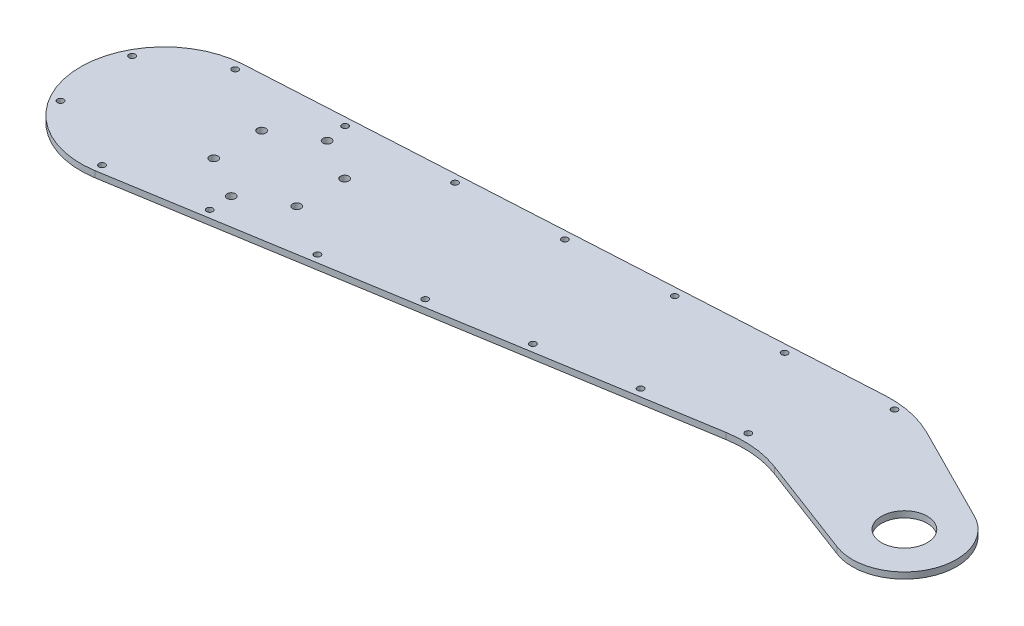
ISO-10303-21;
HEADER;
FILE_DESCRIPTION(('STEP AP214'),'2;1');
FILE_NAME('part.step','',(''),(''),'','','');
FILE_SCHEMA(('AUTOMOTIVE_DESIGN { 1 0 10303 214 1 1 1 1 }'));
ENDSEC;
DATA;
#1=APPLICATION_CONTEXT('core data for automotive mechanical design processes');
#2=APPLICATION_PROTOCOL_DEFINITION('international standard','automotive_design',2000,#1);
#3=PRODUCT_CONTEXT('',#1,'mechanical');
#4=PRODUCT('Part','Part','',(#3));
#5=PRODUCT_RELATED_PRODUCT_CATEGORY('part','',(#4));
#6=PRODUCT_DEFINITION_FORMATION('','',#4);
#7=PRODUCT_DEFINITION_CONTEXT('part definition',#1,'design');
#8=PRODUCT_DEFINITION('design','',#6,#7);
#9=PRODUCT_DEFINITION_SHAPE('','',#8);
#10=(LENGTH_UNIT() NAMED_UNIT(*) SI_UNIT(.MILLI.,.METRE.));
#11=(NAMED_UNIT(*) PLANE_ANGLE_UNIT() SI_UNIT($,.RADIAN.));
#12=(NAMED_UNIT(*) SI_UNIT($,.STERADIAN.) SOLID_ANGLE_UNIT());
#13=UNCERTAINTY_MEASURE_WITH_UNIT(LENGTH_MEASURE(1.E-05),#10,'distance_accuracy_value','');
#14=(GEOMETRIC_REPRESENTATION_CONTEXT(3) GLOBAL_UNCERTAINTY_ASSIGNED_CONTEXT((#13)) GLOBAL_UNIT_ASSIGNED_CONTEXT((#10,
#11,#12)) REPRESENTATION_CONTEXT('',''));
#15=CARTESIAN_POINT('',(0.,0.,0.));
#16=DIRECTION('',(0.,0.,1.));
#17=DIRECTION('',(1.,0.,0.));
#18=AXIS2_PLACEMENT_3D('',#15,#16,#17);
#19=CARTESIAN_POINT('',(6.06249999999998,3.,37.006703362364));
#20=DIRECTION('',(-0.161666666666666,0.,-0.986845422996372));
#21=DIRECTION('',(-0.986845422996372,0.,0.161666666666666));
#22=AXIS2_PLACEMENT_3D('',#19,#20,#21);
#23=PLANE('',#22);
#24=DIRECTION('',(0.986845422996372,0.,-0.161666666666666));
#25=VECTOR('',#24,1.);
#26=CARTESIAN_POINT('',(6.06249999999998,0.,37.006703362364));
#27=LINE('',#26,#25);
#28=CARTESIAN_POINT('',(-43.2100335309859,0.,45.0786121624165));
#29=VERTEX_POINT('',#28);
#30=CARTESIAN_POINT('',(216.856243279225,0.,2.47412000531818));
#31=VERTEX_POINT('',#30);
#32=EDGE_CURVE('E160',#29,#31,#27,.T.);
#33=ORIENTED_EDGE('',*,*,#32,.T.);
#34=DIRECTION('',(0.,-1.,0.));
#35=VECTOR('',#34,1.);
#36=CARTESIAN_POINT('',(216.856243279225,3.,2.47412000531818));
#37=LINE('',#36,#35);
#38=CARTESIAN_POINT('',(216.856243279225,3.,2.47412000531818));
#39=VERTEX_POINT('',#38);
#40=EDGE_CURVE('E180',#31,#39,#37,.F.);
#41=ORIENTED_EDGE('',*,*,#40,.T.);
#42=DIRECTION('',(0.986845422996372,0.,-0.161666666666666));
#43=VECTOR('',#42,1.);
#44=CARTESIAN_POINT('',(6.06249999999998,3.,37.006703362364));
#45=LINE('',#44,#43);
#46=CARTESIAN_POINT('',(-43.2100335309859,3.,45.0786121624165));
#47=VERTEX_POINT('',#46);
#48=EDGE_CURVE('E127',#47,#39,#45,.T.);
#49=ORIENTED_EDGE('',*,*,#48,.F.);
#50=DIRECTION('',(0.,-1.,0.));
#51=VECTOR('',#50,1.);
#52=CARTESIAN_POINT('',(-43.2100335309859,3.,45.0786121624165));
#53=LINE('',#52,#51);
#54=EDGE_CURVE('E138',#47,#29,#53,.T.);
#55=ORIENTED_EDGE('',*,*,#54,.T.);
#56=EDGE_LOOP('',(#33,#41,#49,#55));
#57=FACE_BOUND('',#56,.T.);
#58=ADVANCED_FACE('F35',(#57),#23,.F.);
#59=CARTESIAN_POINT('',(28.6353243988963,3.,-75.7957847250828));
#60=DIRECTION('',(-0.353415271219703,0.,0.935466539256591));
#61=DIRECTION('',(0.935466539256592,0.,0.353415271219703));
#62=AXIS2_PLACEMENT_3D('',#59,#60,#61);
#63=PLANE('',#62);
#64=DIRECTION('',(-0.935466539256591,0.,-0.353415271219703));
#65=VECTOR('',#64,1.);
#66=CARTESIAN_POINT('',(28.6353243988963,3.,-75.7957847250828));
#67=LINE('',#66,#65);
#68=CARTESIAN_POINT('',(291.164618219507,3.,23.3866634814148));
#69=VERTEX_POINT('',#68);
#70=CARTESIAN_POINT('',(242.610340173544,3.,5.04306419230725));
#71=VERTEX_POINT('',#70);
#72=EDGE_CURVE('E108',#69,#71,#67,.T.);
#73=ORIENTED_EDGE('',*,*,#72,.T.);
#74=DIRECTION('',(0.,-1.,0.));
#75=VECTOR('',#74,1.);
#76=CARTESIAN_POINT('',(242.610340173544,3.,5.04306419230723));
#77=LINE('',#76,#75);
#78=CARTESIAN_POINT('',(242.610340173544,0.,5.04306419230725));
#79=VERTEX_POINT('',#78);
#80=EDGE_CURVE('E114',#71,#79,#77,.T.);
#81=ORIENTED_EDGE('',*,*,#80,.T.);
#82=DIRECTION('',(-0.935466539256591,0.,-0.353415271219703));
#83=VECTOR('',#82,1.);
#84=CARTESIAN_POINT('',(28.6353243988963,0.,-75.7957847250828));
#85=LINE('',#84,#83);
#86=CARTESIAN_POINT('',(291.164618219507,0.,23.3866634814148));
#87=VERTEX_POINT('',#86);
#88=EDGE_CURVE('E111',#87,#79,#85,.T.);
#89=ORIENTED_EDGE('',*,*,#88,.F.);
#90=DIRECTION('',(0.,-1.,0.));
#91=VECTOR('',#90,1.);
#92=CARTESIAN_POINT('',(291.164618219507,3.,23.3866634814148));
#93=LINE('',#92,#91);
#94=EDGE_CURVE('E103',#69,#87,#93,.T.);
#95=ORIENTED_EDGE('',*,*,#94,.F.);
#96=EDGE_LOOP('',(#73,#81,#89,#95));
#97=FACE_BOUND('',#96,.T.);
#98=ADVANCED_FACE('F105',(#97),#63,.T.);
#99=CARTESIAN_POINT('',(300.,3.,0.));
#100=DIRECTION('',(0.,-1.,0.));
#101=DIRECTION('',(0.,0.,-1.));
#102=AXIS2_PLACEMENT_3D('',#99,#100,#101);
#103=CYLINDRICAL_SURFACE('',#102,25.);
#104=CARTESIAN_POINT('',(300.,0.,0.));
#105=DIRECTION('',(0.,1.,0.));
#106=DIRECTION('',(0.,0.,1.));
#107=AXIS2_PLACEMENT_3D('',#104,#105,#106);
#108=CIRCLE('',#107,25.);
#109=CARTESIAN_POINT('',(311.267854407603,0.,-22.3167080244614));
#110=VERTEX_POINT('',#109);
#111=EDGE_CURVE('E164',#87,#110,#108,.T.);
#112=ORIENTED_EDGE('',*,*,#111,.T.);
#113=DIRECTION('',(0.,-1.,0.));
#114=VECTOR('',#113,1.);
#115=CARTESIAN_POINT('',(311.267854407603,3.,-22.3167080244614));
#116=LINE('',#115,#114);
#117=CARTESIAN_POINT('',(311.267854407603,3.,-22.3167080244614));
#118=VERTEX_POINT('',#117);
#119=EDGE_CURVE('E115',#118,#110,#116,.T.);
#120=ORIENTED_EDGE('',*,*,#119,.F.);
#121=CARTESIAN_POINT('',(300.,3.,0.));
#122=DIRECTION('',(0.,1.,0.));
#123=DIRECTION('',(0.,0.,1.));
#124=AXIS2_PLACEMENT_3D('',#121,#122,#123);
#125=CIRCLE('',#124,25.);
#126=EDGE_CURVE('E118',#69,#118,#125,.T.);
#127=ORIENTED_EDGE('',*,*,#126,.F.);
#128=ORIENTED_EDGE('',*,*,#94,.T.);
#129=EDGE_LOOP('',(#112,#120,#127,#128));
#130=FACE_BOUND('',#129,.T.);
#131=ADVANCED_FACE('F119',(#130),#103,.T.);
#132=CARTESIAN_POINT('',(72.2108350240547,3.,-143.018188125238));
#133=DIRECTION('',(-0.450714176304124,0.,0.892668320978455));
#134=DIRECTION('',(0.892668320978456,0.,0.450714176304124));
#135=AXIS2_PLACEMENT_3D('',#132,#133,#134);
#136=PLANE('',#135);
#137=DIRECTION('',(-0.892668320978455,0.,-0.450714176304124));
#138=VECTOR('',#137,1.);
#139=CARTESIAN_POINT('',(72.2108350240547,0.,-143.018188125238));
#140=LINE('',#139,#138);
#141=CARTESIAN_POINT('',(264.934966975781,0.,-45.7104912515122));
#142=VERTEX_POINT('',#141);
#143=EDGE_CURVE('E166',#110,#142,#140,.T.);
#144=ORIENTED_EDGE('',*,*,#143,.T.);
#145=DIRECTION('',(0.,-1.,0.));
#146=VECTOR('',#145,1.);
#147=CARTESIAN_POINT('',(264.934966975781,3.,-45.7104912515122));
#148=LINE('',#147,#146);
#149=CARTESIAN_POINT('',(264.934966975781,3.,-45.7104912515122));
#150=VERTEX_POINT('',#149);
#151=EDGE_CURVE('E52',#142,#150,#148,.F.);
#152=ORIENTED_EDGE('',*,*,#151,.T.);
#153=DIRECTION('',(-0.892668320978455,0.,-0.450714176304124));
#154=VECTOR('',#153,1.);
#155=CARTESIAN_POINT('',(72.2108350240547,3.,-143.018188125238));
#156=LINE('',#155,#154);
#157=EDGE_CURVE('E122',#118,#150,#156,.T.);
#158=ORIENTED_EDGE('',*,*,#157,.F.);
#159=ORIENTED_EDGE('',*,*,#119,.T.);
#160=EDGE_LOOP('',(#144,#152,#158,#159));
#161=FACE_BOUND('',#160,.T.);
#162=ADVANCED_FACE('F304',(#161),#136,.F.);
#163=CARTESIAN_POINT('',(-2.10015877365271,3.,-37.4411449227377));
#164=DIRECTION('',(0.0560042339640722,0.,0.998430531273006));
#165=DIRECTION('',(0.998430531273006,0.,-0.0560042339640722));
#166=AXIS2_PLACEMENT_3D('',#163,#164,#165);
#167=PLANE('',#166);
#168=DIRECTION('',(-0.998430531273006,0.,0.0560042339640722));
#169=VECTOR('',#168,1.);
#170=CARTESIAN_POINT('',(-2.10015877365271,3.,-37.4411449227377));
#171=LINE('',#170,#169);
#172=CARTESIAN_POINT('',(239.599046462371,3.,-50.9986017662398));
#173=VERTEX_POINT('',#172);
#174=CARTESIAN_POINT('',(-51.9511290311193,3.,-34.6448908878421));
#175=VERTEX_POINT('',#174);
#176=EDGE_CURVE('E134',#173,#175,#171,.T.);
#177=ORIENTED_EDGE('',*,*,#176,.F.);
#178=DIRECTION('',(0.,-1.,0.));
#179=VECTOR('',#178,1.);
#180=CARTESIAN_POINT('',(239.599046462371,3.,-50.9986017662398));
#181=LINE('',#180,#179);
#182=CARTESIAN_POINT('',(239.599046462371,0.,-50.9986017662398));
#183=VERTEX_POINT('',#182);
#184=EDGE_CURVE('E182',#173,#183,#181,.T.);
#185=ORIENTED_EDGE('',*,*,#184,.T.);
#186=DIRECTION('',(-0.998430531273006,0.,0.0560042339640722));
#187=VECTOR('',#186,1.);
#188=CARTESIAN_POINT('',(-2.10015877365271,0.,-37.4411449227377));
#189=LINE('',#188,#187);
#190=CARTESIAN_POINT('',(-51.9511290311193,0.,-34.6448908878421));
#191=VERTEX_POINT('',#190);
#192=EDGE_CURVE('E168',#183,#191,#189,.T.);
#193=ORIENTED_EDGE('',*,*,#192,.T.);
#194=DIRECTION('',(0.,-1.,0.));
#195=VECTOR('',#194,1.);
#196=CARTESIAN_POINT('',(-51.9511290311193,3.,-34.6448908878421));
#197=LINE('',#196,#195);
#198=EDGE_CURVE('E175',#175,#191,#197,.T.);
#199=ORIENTED_EDGE('',*,*,#198,.F.);
#200=EDGE_LOOP('',(#177,#185,#193,#199));
#201=FACE_BOUND('',#200,.T.);
#202=ADVANCED_FACE('F267',(#201),#167,.F.);
#203=CARTESIAN_POINT('',(0.,3.,-23.));
#204=DIRECTION('',(0.,-1.,0.));
#205=DIRECTION('',(0.,0.,-1.));
#206=AXIS2_PLACEMENT_3D('',#203,#204,#205);
#207=CYLINDRICAL_SURFACE('',#206,2.);
#208=CARTESIAN_POINT('',(0.,3.,-23.));
#209=DIRECTION('',(0.,1.,0.));
#210=DIRECTION('',(0.,0.,1.));
#211=AXIS2_PLACEMENT_3D('',#208,#209,#210);
#212=CIRCLE('',#211,2.);
#213=CARTESIAN_POINT('',(0.,3.,-21.));
#214=VERTEX_POINT('',#213);
#215=EDGE_CURVE('E129',#214,#214,#212,.T.);
#216=ORIENTED_EDGE('',*,*,#215,.T.);
#217=EDGE_LOOP('',(#216));
#218=FACE_BOUND('',#217,.T.);
#219=CARTESIAN_POINT('',(0.,0.,-23.));
#220=DIRECTION('',(0.,1.,0.));
#221=DIRECTION('',(0.,0.,1.));
#222=AXIS2_PLACEMENT_3D('',#219,#220,#221);
#223=CIRCLE('',#222,2.);
#224=CARTESIAN_POINT('',(0.,0.,-21.));
#225=VERTEX_POINT('',#224);
#226=EDGE_CURVE('E157',#225,#225,#223,.T.);
#227=ORIENTED_EDGE('',*,*,#226,.F.);
#228=EDGE_LOOP('',(#227));
#229=FACE_BOUND('',#228,.T.);
#230=ADVANCED_FACE('F263',(#218,#229),#207,.F.);
#231=CARTESIAN_POINT('',(19.9185842870421,3.,-11.5));
#232=DIRECTION('',(0.,-1.,0.));
#233=DIRECTION('',(0.,0.,-1.));
#234=AXIS2_PLACEMENT_3D('',#231,#232,#233);
#235=CYLINDRICAL_SURFACE('',#234,2.);
#236=CARTESIAN_POINT('',(19.9185842870421,3.,-11.5));
#237=DIRECTION('',(0.,1.,0.));
#238=DIRECTION('',(0.,0.,1.));
#239=AXIS2_PLACEMENT_3D('',#236,#237,#238);
#240=CIRCLE('',#239,2.);
#241=CARTESIAN_POINT('',(19.9185842870421,3.,-9.49999999999995));
#242=VERTEX_POINT('',#241);
#243=EDGE_CURVE('E736',#242,#242,#240,.T.);
#244=ORIENTED_EDGE('',*,*,#243,.T.);
#245=EDGE_LOOP('',(#244));
#246=FACE_BOUND('',#245,.T.);
#247=CARTESIAN_POINT('',(19.9185842870421,0.,-11.5));
#248=DIRECTION('',(0.,1.,0.));
#249=DIRECTION('',(0.,0.,1.));
#250=AXIS2_PLACEMENT_3D('',#247,#248,#249);
#251=CIRCLE('',#250,2.);
#252=CARTESIAN_POINT('',(19.9185842870421,0.,-9.49999999999995));
#253=VERTEX_POINT('',#252);
#254=EDGE_CURVE('E154',#253,#253,#251,.T.);
#255=ORIENTED_EDGE('',*,*,#254,.F.);
#256=EDGE_LOOP('',(#255));
#257=FACE_BOUND('',#256,.T.);
#258=ADVANCED_FACE('F266',(#246,#257),#235,.F.);
#259=CARTESIAN_POINT('',(19.918584287042,3.,11.5000000000001));
#260=DIRECTION('',(0.,-1.,0.));
#261=DIRECTION('',(0.,0.,-1.));
#262=AXIS2_PLACEMENT_3D('',#259,#260,#261);
#263=CYLINDRICAL_SURFACE('',#262,2.);
#264=CARTESIAN_POINT('',(19.918584287042,3.,11.5000000000001));
#265=DIRECTION('',(0.,1.,0.));
#266=DIRECTION('',(0.,0.,1.));
#267=AXIS2_PLACEMENT_3D('',#264,#265,#266);
#268=CIRCLE('',#267,2.);
#269=CARTESIAN_POINT('',(19.918584287042,3.,13.5000000000001));
#270=VERTEX_POINT('',#269);
#271=EDGE_CURVE('E733',#270,#270,#268,.T.);
#272=ORIENTED_EDGE('',*,*,#271,.T.);
#273=EDGE_LOOP('',(#272));
#274=FACE_BOUND('',#273,.T.);
#275=CARTESIAN_POINT('',(19.918584287042,0.,11.5000000000001));
#276=DIRECTION('',(0.,1.,0.));
#277=DIRECTION('',(0.,0.,1.));
#278=AXIS2_PLACEMENT_3D('',#275,#276,#277);
#279=CIRCLE('',#278,2.);
#280=CARTESIAN_POINT('',(19.918584287042,0.,13.5000000000001));
#281=VERTEX_POINT('',#280);
#282=EDGE_CURVE('E151',#281,#281,#279,.T.);
#283=ORIENTED_EDGE('',*,*,#282,.F.);
#284=EDGE_LOOP('',(#283));
#285=FACE_BOUND('',#284,.T.);
#286=ADVANCED_FACE('F271',(#274,#285),#263,.F.);
#287=CARTESIAN_POINT('',(-1.60608141586784E-13,3.,23.));
#288=DIRECTION('',(0.,-1.,0.));
#289=DIRECTION('',(0.,0.,-1.));
#290=AXIS2_PLACEMENT_3D('',#287,#288,#289);
#291=CYLINDRICAL_SURFACE('',#290,2.);
#292=CARTESIAN_POINT('',(-1.60608141586784E-13,3.,23.));
#293=DIRECTION('',(0.,1.,0.));
#294=DIRECTION('',(0.,0.,1.));
#295=AXIS2_PLACEMENT_3D('',#292,#293,#294);
#296=CIRCLE('',#295,2.);
#297=CARTESIAN_POINT('',(-1.60608141586784E-13,3.,25.));
#298=VERTEX_POINT('',#297);
#299=EDGE_CURVE('E730',#298,#298,#296,.T.);
#300=ORIENTED_EDGE('',*,*,#299,.T.);
#301=EDGE_LOOP('',(#300));
#302=FACE_BOUND('',#301,.T.);
#303=CARTESIAN_POINT('',(-1.60608141586784E-13,0.,23.));
#304=DIRECTION('',(0.,1.,0.));
#305=DIRECTION('',(0.,0.,1.));
#306=AXIS2_PLACEMENT_3D('',#303,#304,#305);
#307=CIRCLE('',#306,2.);
#308=CARTESIAN_POINT('',(-1.60608141586784E-13,0.,25.));
#309=VERTEX_POINT('',#308);
#310=EDGE_CURVE('E148',#309,#309,#307,.T.);
#311=ORIENTED_EDGE('',*,*,#310,.F.);
#312=EDGE_LOOP('',(#311));
#313=FACE_BOUND('',#312,.T.);
#314=ADVANCED_FACE('F275',(#302,#313),#291,.F.);
#315=CARTESIAN_POINT('',(-19.9185842870422,3.,11.4999999999998));
#316=DIRECTION('',(0.,-1.,0.));
#317=DIRECTION('',(0.,0.,-1.));
#318=AXIS2_PLACEMENT_3D('',#315,#316,#317);
#319=CYLINDRICAL_SURFACE('',#318,2.);
#320=CARTESIAN_POINT('',(-19.9185842870422,3.,11.4999999999998));
#321=DIRECTION('',(0.,1.,0.));
#322=DIRECTION('',(0.,0.,1.));
#323=AXIS2_PLACEMENT_3D('',#320,#321,#322);
#324=CIRCLE('',#323,2.);
#325=CARTESIAN_POINT('',(-19.9185842870422,3.,13.4999999999998));
#326=VERTEX_POINT('',#325);
#327=EDGE_CURVE('E727',#326,#326,#324,.T.);
#328=ORIENTED_EDGE('',*,*,#327,.T.);
#329=EDGE_LOOP('',(#328));
#330=FACE_BOUND('',#329,.T.);
#331=CARTESIAN_POINT('',(-19.9185842870422,0.,11.4999999999998));
#332=DIRECTION('',(0.,1.,0.));
#333=DIRECTION('',(0.,0.,1.));
#334=AXIS2_PLACEMENT_3D('',#331,#332,#333);
#335=CIRCLE('',#334,2.);
#336=CARTESIAN_POINT('',(-19.9185842870422,0.,13.4999999999998));
#337=VERTEX_POINT('',#336);
#338=EDGE_CURVE('E145',#337,#337,#335,.T.);
#339=ORIENTED_EDGE('',*,*,#338,.F.);
#340=EDGE_LOOP('',(#339));
#341=FACE_BOUND('',#340,.T.);
#342=ADVANCED_FACE('F279',(#330,#341),#319,.F.);
#343=CARTESIAN_POINT('',(-19.918584287042,3.,-11.5000000000002));
#344=DIRECTION('',(0.,-1.,0.));
#345=DIRECTION('',(0.,0.,-1.));
#346=AXIS2_PLACEMENT_3D('',#343,#344,#345);
#347=CYLINDRICAL_SURFACE('',#346,2.);
#348=CARTESIAN_POINT('',(-19.918584287042,3.,-11.5000000000002));
#349=DIRECTION('',(0.,1.,0.));
#350=DIRECTION('',(0.,0.,1.));
#351=AXIS2_PLACEMENT_3D('',#348,#349,#350);
#352=CIRCLE('',#351,2.);
#353=CARTESIAN_POINT('',(-19.918584287042,3.,-9.50000000000023));
#354=VERTEX_POINT('',#353);
#355=EDGE_CURVE('E724',#354,#354,#352,.T.);
#356=ORIENTED_EDGE('',*,*,#355,.T.);
#357=EDGE_LOOP('',(#356));
#358=FACE_BOUND('',#357,.T.);
#359=CARTESIAN_POINT('',(-19.918584287042,0.,-11.5000000000002));
#360=DIRECTION('',(0.,1.,0.));
#361=DIRECTION('',(0.,0.,1.));
#362=AXIS2_PLACEMENT_3D('',#359,#360,#361);
#363=CIRCLE('',#362,2.);
#364=CARTESIAN_POINT('',(-19.918584287042,0.,-9.50000000000023));
#365=VERTEX_POINT('',#364);
#366=EDGE_CURVE('E142',#365,#365,#363,.T.);
#367=ORIENTED_EDGE('',*,*,#366,.F.);
#368=EDGE_LOOP('',(#367));
#369=FACE_BOUND('',#368,.T.);
#370=ADVANCED_FACE('F283',(#358,#369),#347,.F.);
#371=CARTESIAN_POINT('',(300.,3.,0.));
#372=DIRECTION('',(0.,-1.,0.));
#373=DIRECTION('',(0.,0.,-1.));
#374=AXIS2_PLACEMENT_3D('',#371,#372,#373);
#375=CYLINDRICAL_SURFACE('',#374,11.);
#376=CARTESIAN_POINT('',(300.,3.,0.));
#377=DIRECTION('',(0.,1.,0.));
#378=DIRECTION('',(0.,0.,1.));
#379=AXIS2_PLACEMENT_3D('',#376,#377,#378);
#380=CIRCLE('',#379,11.);
#381=CARTESIAN_POINT('',(300.,3.,11.));
#382=VERTEX_POINT('',#381);
#383=EDGE_CURVE('E172',#382,#382,#380,.T.);
#384=ORIENTED_EDGE('',*,*,#383,.T.);
#385=EDGE_LOOP('',(#384));
#386=FACE_BOUND('',#385,.T.);
#387=CARTESIAN_POINT('',(300.,0.,0.));
#388=DIRECTION('',(0.,1.,0.));
#389=DIRECTION('',(0.,0.,1.));
#390=AXIS2_PLACEMENT_3D('',#387,#388,#389);
#391=CIRCLE('',#390,11.);
#392=CARTESIAN_POINT('',(300.,0.,11.));
#393=VERTEX_POINT('',#392);
#394=EDGE_CURVE('E139',#393,#393,#391,.T.);
#395=ORIENTED_EDGE('',*,*,#394,.F.);
#396=EDGE_LOOP('',(#395));
#397=FACE_BOUND('',#396,.T.);
#398=ADVANCED_FACE('F287',(#386,#397),#375,.F.);
#399=CARTESIAN_POINT('',(-49.7021451013738,3.,5.44947449961796));
#400=DIRECTION('',(0.,-1.,0.));
#401=DIRECTION('',(0.,0.,-1.));
#402=AXIS2_PLACEMENT_3D('',#399,#400,#401);
#403=CYLINDRICAL_SURFACE('',#402,40.1573911570387);
#404=CARTESIAN_POINT('',(-49.7021451013738,0.,5.44947449961796));
#405=DIRECTION('',(0.,1.,0.));
#406=DIRECTION('',(0.,0.,1.));
#407=AXIS2_PLACEMENT_3D('',#404,#405,#406);
#408=CIRCLE('',#407,40.1573911570387);
#409=EDGE_CURVE('E170',#191,#29,#408,.T.);
#410=ORIENTED_EDGE('',*,*,#409,.T.);
#411=ORIENTED_EDGE('',*,*,#54,.F.);
#412=CARTESIAN_POINT('',(-49.7021451013738,3.,5.44947449961796));
#413=DIRECTION('',(0.,1.,0.));
#414=DIRECTION('',(0.,0.,1.));
#415=AXIS2_PLACEMENT_3D('',#412,#413,#414);
#416=CIRCLE('',#415,40.1573911570387);
#417=EDGE_CURVE('E136',#175,#47,#416,.T.);
#418=ORIENTED_EDGE('',*,*,#417,.F.);
#419=ORIENTED_EDGE('',*,*,#198,.T.);
#420=EDGE_LOOP('',(#410,#411,#418,#419));
#421=FACE_BOUND('',#420,.T.);
#422=ADVANCED_FACE('F290',(#421),#403,.T.);
#423=CARTESIAN_POINT('',(0.,3.,0.));
#424=DIRECTION('',(0.,1.,0.));
#425=DIRECTION('',(0.,0.,1.));
#426=AXIS2_PLACEMENT_3D('',#423,#424,#425);
#427=PLANE('',#426);
#428=CARTESIAN_POINT('',(-43.8567001976525,3.,41.1312304704311));
#429=DIRECTION('',(0.,1.,0.));
#430=DIRECTION('',(0.,0.,1.));
#431=AXIS2_PLACEMENT_3D('',#428,#429,#430);
#432=CIRCLE('',#431,1.5);
#433=CARTESIAN_POINT('',(-43.8567001976525,3.,42.6312304704311));
#434=VERTEX_POINT('',#433);
#435=EDGE_CURVE('E194',#434,#434,#432,.T.);
#436=ORIENTED_EDGE('',*,*,#435,.F.);
#437=EDGE_LOOP('',(#436));
#438=FACE_BOUND('',#437,.T.);
#439=CARTESIAN_POINT('',(89.3674319068577,3.,19.3062304704311));
#440=DIRECTION('',(0.,1.,0.));
#441=DIRECTION('',(0.,0.,1.));
#442=AXIS2_PLACEMENT_3D('',#439,#440,#441);
#443=CIRCLE('',#442,1.50000000000001);
#444=CARTESIAN_POINT('',(89.3674319068577,3.,20.8062304704311));
#445=VERTEX_POINT('',#444);
#446=EDGE_CURVE('E684',#445,#445,#443,.T.);
#447=ORIENTED_EDGE('',*,*,#446,.F.);
#448=EDGE_LOOP('',(#447));
#449=FACE_BOUND('',#448,.T.);
#450=CARTESIAN_POINT('',(44.959387872021,3.,26.5812304704311));
#451=DIRECTION('',(0.,1.,0.));
#452=DIRECTION('',(0.,0.,1.));
#453=AXIS2_PLACEMENT_3D('',#450,#451,#452);
#454=CIRCLE('',#453,1.5);
#455=CARTESIAN_POINT('',(44.959387872021,3.,28.0812304704311));
#456=VERTEX_POINT('',#455);
#457=EDGE_CURVE('E619',#456,#456,#454,.T.);
#458=ORIENTED_EDGE('',*,*,#457,.F.);
#459=EDGE_LOOP('',(#458));
#460=FACE_BOUND('',#459,.T.);
#461=CARTESIAN_POINT('',(0.551343837184207,3.,33.8562304704311));
#462=DIRECTION('',(0.,1.,0.));
#463=DIRECTION('',(0.,0.,1.));
#464=AXIS2_PLACEMENT_3D('',#461,#462,#463);
#465=CIRCLE('',#464,1.5);
#466=CARTESIAN_POINT('',(0.551343837184207,3.,35.3562304704311));
#467=VERTEX_POINT('',#466);
#468=EDGE_CURVE('E683',#467,#467,#465,.T.);
#469=ORIENTED_EDGE('',*,*,#468,.F.);
#470=EDGE_LOOP('',(#469));
#471=FACE_BOUND('',#470,.T.);
#472=CARTESIAN_POINT('',(247.802047286639,3.,-47.4524389519717));
#473=DIRECTION('',(0.,1.,0.));
#474=DIRECTION('',(0.,0.,1.));
#475=AXIS2_PLACEMENT_3D('',#472,#473,#474);
#476=CIRCLE('',#475,1.5);
#477=CARTESIAN_POINT('',(247.802047286639,3.,-45.9524389519717));
#478=VERTEX_POINT('',#477);
#479=EDGE_CURVE('E687',#478,#478,#476,.T.);
#480=ORIENTED_EDGE('',*,*,#479,.F.);
#481=EDGE_LOOP('',(#480));
#482=FACE_BOUND('',#481,.T.);
#483=CARTESIAN_POINT('',(133.775475941694,3.,12.0312304704311));
#484=DIRECTION('',(0.,1.,0.));
#485=DIRECTION('',(0.,0.,1.));
#486=AXIS2_PLACEMENT_3D('',#483,#484,#485);
#487=CIRCLE('',#486,1.5);
#488=CARTESIAN_POINT('',(133.775475941694,3.,13.5312304704311));
#489=VERTEX_POINT('',#488);
#490=EDGE_CURVE('E690',#489,#489,#487,.T.);
#491=ORIENTED_EDGE('',*,*,#490,.F.);
#492=EDGE_LOOP('',(#491));
#493=FACE_BOUND('',#492,.T.);
#494=CARTESIAN_POINT('',(178.183519976531,3.,4.75623047043111));
#495=DIRECTION('',(0.,1.,0.));
#496=DIRECTION('',(0.,0.,1.));
#497=AXIS2_PLACEMENT_3D('',#494,#495,#496);
#498=CIRCLE('',#497,1.50000000000002);
#499=CARTESIAN_POINT('',(178.183519976531,3.,6.25623047043113));
#500=VERTEX_POINT('',#499);
#501=EDGE_CURVE('E772',#500,#500,#498,.T.);
#502=ORIENTED_EDGE('',*,*,#501,.F.);
#503=EDGE_LOOP('',(#502));
#504=FACE_BOUND('',#503,.T.);
#505=CARTESIAN_POINT('',(222.591564011368,3.,-2.51876952956888));
#506=DIRECTION('',(0.,1.,0.));
#507=DIRECTION('',(0.,0.,1.));
#508=AXIS2_PLACEMENT_3D('',#505,#506,#507);
#509=CIRCLE('',#508,1.5);
#510=CARTESIAN_POINT('',(222.591564011368,3.,-1.01876952956888));
#511=VERTEX_POINT('',#510);
#512=EDGE_CURVE('E693',#511,#511,#509,.T.);
#513=ORIENTED_EDGE('',*,*,#512,.F.);
#514=EDGE_LOOP('',(#513));
#515=FACE_BOUND('',#514,.T.);
#516=CARTESIAN_POINT('',(-1.80558553161273,3.,-33.4513804609537));
#517=DIRECTION('',(0.,1.,0.));
#518=DIRECTION('',(0.,0.,1.));
#519=AXIS2_PLACEMENT_3D('',#516,#517,#518);
#520=CIRCLE('',#519,1.5);
#521=CARTESIAN_POINT('',(-1.80558553161273,3.,-31.9513804609537));
#522=VERTEX_POINT('',#521);
#523=EDGE_CURVE('E711',#522,#522,#520,.T.);
#524=ORIENTED_EDGE('',*,*,#523,.F.);
#525=EDGE_LOOP('',(#524));
#526=FACE_BOUND('',#525,.T.);
#527=CARTESIAN_POINT('',(-51.727112095263,3.,-30.6511687627501));
#528=DIRECTION('',(0.,1.,0.));
#529=DIRECTION('',(0.,0.,1.));
#530=AXIS2_PLACEMENT_3D('',#527,#528,#529);
#531=CIRCLE('',#530,1.5);
#532=CARTESIAN_POINT('',(-51.727112095263,3.,-29.1511687627501));
#533=VERTEX_POINT('',#532);
#534=EDGE_CURVE('E714',#533,#533,#531,.T.);
#535=ORIENTED_EDGE('',*,*,#534,.F.);
#536=EDGE_LOOP('',(#535));
#537=FACE_BOUND('',#536,.T.);
#538=CARTESIAN_POINT('',(48.1159410320376,3.,-36.2515921591573));
#539=DIRECTION('',(0.,1.,0.));
#540=DIRECTION('',(0.,0.,1.));
#541=AXIS2_PLACEMENT_3D('',#538,#539,#540);
#542=CIRCLE('',#541,1.5);
#543=CARTESIAN_POINT('',(48.1159410320376,3.,-34.7515921591573));
#544=VERTEX_POINT('',#543);
#545=EDGE_CURVE('E717',#544,#544,#542,.T.);
#546=ORIENTED_EDGE('',*,*,#545,.F.);
#547=EDGE_LOOP('',(#546));
#548=FACE_BOUND('',#547,.T.);
#549=CARTESIAN_POINT('',(98.0374675956879,3.,-39.0518038573609));
#550=DIRECTION('',(0.,1.,0.));
#551=DIRECTION('',(0.,0.,1.));
#552=AXIS2_PLACEMENT_3D('',#549,#550,#551);
#553=CIRCLE('',#552,1.5);
#554=CARTESIAN_POINT('',(98.0374675956879,3.,-37.5518038573609));
#555=VERTEX_POINT('',#554);
#556=EDGE_CURVE('E702',#555,#555,#553,.T.);
#557=ORIENTED_EDGE('',*,*,#556,.F.);
#558=EDGE_LOOP('',(#557));
#559=FACE_BOUND('',#558,.T.);
#560=CARTESIAN_POINT('',(-80.5430380850716,3.,24.3566850524579));
#561=DIRECTION('',(0.,1.,0.));
#562=DIRECTION('',(0.,0.,1.));
#563=AXIS2_PLACEMENT_3D('',#560,#561,#562);
#564=CIRCLE('',#563,1.50000000000001);
#565=CARTESIAN_POINT('',(-80.5430380850716,3.,25.8566850524579));
#566=VERTEX_POINT('',#565);
#567=EDGE_CURVE('E699',#566,#566,#564,.T.);
#568=ORIENTED_EDGE('',*,*,#567,.F.);
#569=EDGE_LOOP('',(#568));
#570=FACE_BOUND('',#569,.T.);
#571=CARTESIAN_POINT('',(-82.0144746940443,3.,-11.4656831687282));
#572=DIRECTION('',(0.,1.,0.));
#573=DIRECTION('',(0.,0.,1.));
#574=AXIS2_PLACEMENT_3D('',#571,#572,#573);
#575=CIRCLE('',#574,1.5);
#576=CARTESIAN_POINT('',(-82.0144746940443,3.,-9.96568316872822));
#577=VERTEX_POINT('',#576);
#578=EDGE_CURVE('E703',#577,#577,#575,.T.);
#579=ORIENTED_EDGE('',*,*,#578,.F.);
#580=EDGE_LOOP('',(#579));
#581=FACE_BOUND('',#580,.T.);
#582=CARTESIAN_POINT('',(147.958994159338,3.,-41.8520155555645));
#583=DIRECTION('',(0.,1.,0.));
#584=DIRECTION('',(0.,0.,1.));
#585=AXIS2_PLACEMENT_3D('',#582,#583,#584);
#586=CIRCLE('',#585,1.5);
#587=CARTESIAN_POINT('',(147.958994159338,3.,-40.3520155555645));
#588=VERTEX_POINT('',#587);
#589=EDGE_CURVE('E706',#588,#588,#586,.T.);
#590=ORIENTED_EDGE('',*,*,#589,.F.);
#591=EDGE_LOOP('',(#590));
#592=FACE_BOUND('',#591,.T.);
#593=CARTESIAN_POINT('',(197.880520722989,3.,-44.6522272537681));
#594=DIRECTION('',(0.,1.,0.));
#595=DIRECTION('',(0.,0.,1.));
#596=AXIS2_PLACEMENT_3D('',#593,#594,#595);
#597=CIRCLE('',#596,1.5);
#598=CARTESIAN_POINT('',(197.880520722989,3.,-43.1522272537681));
#599=VERTEX_POINT('',#598);
#600=EDGE_CURVE('E697',#599,#599,#597,.T.);
#601=ORIENTED_EDGE('',*,*,#600,.F.);
#602=EDGE_LOOP('',(#601));
#603=FACE_BOUND('',#602,.T.);
#604=ORIENTED_EDGE('',*,*,#383,.F.);
#605=EDGE_LOOP('',(#604));
#606=FACE_BOUND('',#605,.T.);
#607=ORIENTED_EDGE('',*,*,#355,.F.);
#608=EDGE_LOOP('',(#607));
#609=FACE_BOUND('',#608,.T.);
#610=ORIENTED_EDGE('',*,*,#327,.F.);
#611=EDGE_LOOP('',(#610));
#612=FACE_BOUND('',#611,.T.);
#613=ORIENTED_EDGE('',*,*,#299,.F.);
#614=EDGE_LOOP('',(#613));
#615=FACE_BOUND('',#614,.T.);
#616=ORIENTED_EDGE('',*,*,#271,.F.);
#617=EDGE_LOOP('',(#616));
#618=FACE_BOUND('',#617,.T.);
#619=ORIENTED_EDGE('',*,*,#243,.F.);
#620=EDGE_LOOP('',(#619));
#621=FACE_BOUND('',#620,.T.);
#622=ORIENTED_EDGE('',*,*,#215,.F.);
#623=EDGE_LOOP('',(#622));
#624=FACE_BOUND('',#623,.T.);
#625=ORIENTED_EDGE('',*,*,#157,.T.);
#626=CARTESIAN_POINT('',(242.399258160575,3.,-1.07707520258945));
#627=DIRECTION('',(0.,1.,0.));
#628=DIRECTION('',(0.,0.,1.));
#629=AXIS2_PLACEMENT_3D('',#626,#627,#628);
#630=CIRCLE('',#629,50.);
#631=EDGE_CURVE('E187',#150,#173,#630,.T.);
#632=ORIENTED_EDGE('',*,*,#631,.T.);
#633=ORIENTED_EDGE('',*,*,#176,.T.);
#634=ORIENTED_EDGE('',*,*,#417,.T.);
#635=ORIENTED_EDGE('',*,*,#48,.T.);
#636=CARTESIAN_POINT('',(224.939576612559,3.,51.8163911551368));
#637=DIRECTION('',(0.,1.,0.));
#638=DIRECTION('',(0.,0.,1.));
#639=AXIS2_PLACEMENT_3D('',#636,#637,#638);
#640=CIRCLE('',#639,50.);
#641=EDGE_CURVE('E11',#39,#71,#640,.F.);
#642=ORIENTED_EDGE('',*,*,#641,.T.);
#643=ORIENTED_EDGE('',*,*,#72,.F.);
#644=ORIENTED_EDGE('',*,*,#126,.T.);
#645=EDGE_LOOP('',(#625,#632,#633,#634,#635,#642,#643,#644));
#646=FACE_BOUND('',#645,.T.);
#647=ADVANCED_FACE('F124',(#438,#449,#460,#471,#482,#493,#504,#515,#526,#537,#548,#559,#570,
#581,#592,#603,#606,#609,#612,#615,#618,#621,#624,#646),#427,.T.);
#648=CARTESIAN_POINT('',(0.,0.,0.));
#649=DIRECTION('',(0.,1.,0.));
#650=DIRECTION('',(0.,0.,1.));
#651=AXIS2_PLACEMENT_3D('',#648,#649,#650);
#652=PLANE('',#651);
#653=CARTESIAN_POINT('',(-43.8567001976525,0.,41.1312304704311));
#654=DIRECTION('',(0.,1.,0.));
#655=DIRECTION('',(0.,0.,1.));
#656=AXIS2_PLACEMENT_3D('',#653,#654,#655);
#657=CIRCLE('',#656,1.5);
#658=CARTESIAN_POINT('',(-43.8567001976525,0.,42.6312304704311));
#659=VERTEX_POINT('',#658);
#660=EDGE_CURVE('E39',#659,#659,#657,.T.);
#661=ORIENTED_EDGE('',*,*,#660,.T.);
#662=EDGE_LOOP('',(#661));
#663=FACE_BOUND('',#662,.T.);
#664=CARTESIAN_POINT('',(89.3674319068577,0.,19.3062304704311));
#665=DIRECTION('',(0.,1.,0.));
#666=DIRECTION('',(0.,0.,1.));
#667=AXIS2_PLACEMENT_3D('',#664,#665,#666);
#668=CIRCLE('',#667,1.50000000000001);
#669=CARTESIAN_POINT('',(89.3674319068577,0.,20.8062304704311));
#670=VERTEX_POINT('',#669);
#671=EDGE_CURVE('E232',#670,#670,#668,.T.);
#672=ORIENTED_EDGE('',*,*,#671,.T.);
#673=EDGE_LOOP('',(#672));
#674=FACE_BOUND('',#673,.T.);
#675=CARTESIAN_POINT('',(44.959387872021,0.,26.5812304704311));
#676=DIRECTION('',(0.,1.,0.));
#677=DIRECTION('',(0.,0.,1.));
#678=AXIS2_PLACEMENT_3D('',#675,#676,#677);
#679=CIRCLE('',#678,1.5);
#680=CARTESIAN_POINT('',(44.959387872021,0.,28.0812304704311));
#681=VERTEX_POINT('',#680);
#682=EDGE_CURVE('E230',#681,#681,#679,.T.);
#683=ORIENTED_EDGE('',*,*,#682,.T.);
#684=EDGE_LOOP('',(#683));
#685=FACE_BOUND('',#684,.T.);
#686=CARTESIAN_POINT('',(0.551343837184207,0.,33.8562304704311));
#687=DIRECTION('',(0.,1.,0.));
#688=DIRECTION('',(0.,0.,1.));
#689=AXIS2_PLACEMENT_3D('',#686,#687,#688);
#690=CIRCLE('',#689,1.5);
#691=CARTESIAN_POINT('',(0.551343837184207,0.,35.3562304704311));
#692=VERTEX_POINT('',#691);
#693=EDGE_CURVE('E227',#692,#692,#690,.T.);
#694=ORIENTED_EDGE('',*,*,#693,.T.);
#695=EDGE_LOOP('',(#694));
#696=FACE_BOUND('',#695,.T.);
#697=CARTESIAN_POINT('',(247.802047286639,0.,-47.4524389519717));
#698=DIRECTION('',(0.,1.,0.));
#699=DIRECTION('',(0.,0.,1.));
#700=AXIS2_PLACEMENT_3D('',#697,#698,#699);
#701=CIRCLE('',#700,1.5);
#702=CARTESIAN_POINT('',(247.802047286639,0.,-45.9524389519717));
#703=VERTEX_POINT('',#702);
#704=EDGE_CURVE('E224',#703,#703,#701,.T.);
#705=ORIENTED_EDGE('',*,*,#704,.T.);
#706=EDGE_LOOP('',(#705));
#707=FACE_BOUND('',#706,.T.);
#708=CARTESIAN_POINT('',(133.775475941694,0.,12.0312304704311));
#709=DIRECTION('',(0.,1.,0.));
#710=DIRECTION('',(0.,0.,1.));
#711=AXIS2_PLACEMENT_3D('',#708,#709,#710);
#712=CIRCLE('',#711,1.5);
#713=CARTESIAN_POINT('',(133.775475941694,0.,13.5312304704311));
#714=VERTEX_POINT('',#713);
#715=EDGE_CURVE('E221',#714,#714,#712,.T.);
#716=ORIENTED_EDGE('',*,*,#715,.T.);
#717=EDGE_LOOP('',(#716));
#718=FACE_BOUND('',#717,.T.);
#719=CARTESIAN_POINT('',(178.183519976531,0.,4.75623047043111));
#720=DIRECTION('',(0.,1.,0.));
#721=DIRECTION('',(0.,0.,1.));
#722=AXIS2_PLACEMENT_3D('',#719,#720,#721);
#723=CIRCLE('',#722,1.50000000000002);
#724=CARTESIAN_POINT('',(178.183519976531,0.,6.25623047043113));
#725=VERTEX_POINT('',#724);
#726=EDGE_CURVE('E218',#725,#725,#723,.T.);
#727=ORIENTED_EDGE('',*,*,#726,.T.);
#728=EDGE_LOOP('',(#727));
#729=FACE_BOUND('',#728,.T.);
#730=CARTESIAN_POINT('',(222.591564011368,0.,-2.51876952956888));
#731=DIRECTION('',(0.,1.,0.));
#732=DIRECTION('',(0.,0.,1.));
#733=AXIS2_PLACEMENT_3D('',#730,#731,#732);
#734=CIRCLE('',#733,1.5);
#735=CARTESIAN_POINT('',(222.591564011368,0.,-1.01876952956888));
#736=VERTEX_POINT('',#735);
#737=EDGE_CURVE('E215',#736,#736,#734,.T.);
#738=ORIENTED_EDGE('',*,*,#737,.T.);
#739=EDGE_LOOP('',(#738));
#740=FACE_BOUND('',#739,.T.);
#741=CARTESIAN_POINT('',(-1.80558553161273,0.,-33.4513804609537));
#742=DIRECTION('',(0.,1.,0.));
#743=DIRECTION('',(0.,0.,1.));
#744=AXIS2_PLACEMENT_3D('',#741,#742,#743);
#745=CIRCLE('',#744,1.5);
#746=CARTESIAN_POINT('',(-1.80558553161273,0.,-31.9513804609537));
#747=VERTEX_POINT('',#746);
#748=EDGE_CURVE('E212',#747,#747,#745,.T.);
#749=ORIENTED_EDGE('',*,*,#748,.T.);
#750=EDGE_LOOP('',(#749));
#751=FACE_BOUND('',#750,.T.);
#752=CARTESIAN_POINT('',(-51.727112095263,0.,-30.6511687627501));
#753=DIRECTION('',(0.,1.,0.));
#754=DIRECTION('',(0.,0.,1.));
#755=AXIS2_PLACEMENT_3D('',#752,#753,#754);
#756=CIRCLE('',#755,1.5);
#757=CARTESIAN_POINT('',(-51.727112095263,0.,-29.1511687627501));
#758=VERTEX_POINT('',#757);
#759=EDGE_CURVE('E209',#758,#758,#756,.T.);
#760=ORIENTED_EDGE('',*,*,#759,.T.);
#761=EDGE_LOOP('',(#760));
#762=FACE_BOUND('',#761,.T.);
#763=CARTESIAN_POINT('',(48.1159410320376,0.,-36.2515921591573));
#764=DIRECTION('',(0.,1.,0.));
#765=DIRECTION('',(0.,0.,1.));
#766=AXIS2_PLACEMENT_3D('',#763,#764,#765);
#767=CIRCLE('',#766,1.5);
#768=CARTESIAN_POINT('',(48.1159410320376,0.,-34.7515921591573));
#769=VERTEX_POINT('',#768);
#770=EDGE_CURVE('E206',#769,#769,#767,.T.);
#771=ORIENTED_EDGE('',*,*,#770,.T.);
#772=EDGE_LOOP('',(#771));
#773=FACE_BOUND('',#772,.T.);
#774=CARTESIAN_POINT('',(98.0374675956879,0.,-39.0518038573609));
#775=DIRECTION('',(0.,1.,0.));
#776=DIRECTION('',(0.,0.,1.));
#777=AXIS2_PLACEMENT_3D('',#774,#775,#776);
#778=CIRCLE('',#777,1.5);
#779=CARTESIAN_POINT('',(98.0374675956879,0.,-37.5518038573609));
#780=VERTEX_POINT('',#779);
#781=EDGE_CURVE('E203',#780,#780,#778,.T.);
#782=ORIENTED_EDGE('',*,*,#781,.T.);
#783=EDGE_LOOP('',(#782));
#784=FACE_BOUND('',#783,.T.);
#785=CARTESIAN_POINT('',(-80.5430380850716,0.,24.3566850524579));
#786=DIRECTION('',(0.,1.,0.));
#787=DIRECTION('',(0.,0.,1.));
#788=AXIS2_PLACEMENT_3D('',#785,#786,#787);
#789=CIRCLE('',#788,1.50000000000001);
#790=CARTESIAN_POINT('',(-80.5430380850716,0.,25.8566850524579));
#791=VERTEX_POINT('',#790);
#792=EDGE_CURVE('E200',#791,#791,#789,.T.);
#793=ORIENTED_EDGE('',*,*,#792,.T.);
#794=EDGE_LOOP('',(#793));
#795=FACE_BOUND('',#794,.T.);
#796=CARTESIAN_POINT('',(-82.0144746940443,0.,-11.4656831687282));
#797=DIRECTION('',(0.,1.,0.));
#798=DIRECTION('',(0.,0.,1.));
#799=AXIS2_PLACEMENT_3D('',#796,#797,#798);
#800=CIRCLE('',#799,1.5);
#801=CARTESIAN_POINT('',(-82.0144746940443,0.,-9.96568316872822));
#802=VERTEX_POINT('',#801);
#803=EDGE_CURVE('E197',#802,#802,#800,.T.);
#804=ORIENTED_EDGE('',*,*,#803,.T.);
#805=EDGE_LOOP('',(#804));
#806=FACE_BOUND('',#805,.T.);
#807=CARTESIAN_POINT('',(147.958994159338,0.,-41.8520155555645));
#808=DIRECTION('',(0.,1.,0.));
#809=DIRECTION('',(0.,0.,1.));
#810=AXIS2_PLACEMENT_3D('',#807,#808,#809);
#811=CIRCLE('',#810,1.5);
#812=CARTESIAN_POINT('',(147.958994159338,0.,-40.3520155555645));
#813=VERTEX_POINT('',#812);
#814=EDGE_CURVE('E193',#813,#813,#811,.T.);
#815=ORIENTED_EDGE('',*,*,#814,.T.);
#816=EDGE_LOOP('',(#815));
#817=FACE_BOUND('',#816,.T.);
#818=CARTESIAN_POINT('',(197.880520722989,0.,-44.6522272537681));
#819=DIRECTION('',(0.,1.,0.));
#820=DIRECTION('',(0.,0.,1.));
#821=AXIS2_PLACEMENT_3D('',#818,#819,#820);
#822=CIRCLE('',#821,1.5);
#823=CARTESIAN_POINT('',(197.880520722989,0.,-43.1522272537681));
#824=VERTEX_POINT('',#823);
#825=EDGE_CURVE('E190',#824,#824,#822,.T.);
#826=ORIENTED_EDGE('',*,*,#825,.T.);
#827=EDGE_LOOP('',(#826));
#828=FACE_BOUND('',#827,.T.);
#829=ORIENTED_EDGE('',*,*,#394,.T.);
#830=EDGE_LOOP('',(#829));
#831=FACE_BOUND('',#830,.T.);
#832=ORIENTED_EDGE('',*,*,#366,.T.);
#833=EDGE_LOOP('',(#832));
#834=FACE_BOUND('',#833,.T.);
#835=ORIENTED_EDGE('',*,*,#338,.T.);
#836=EDGE_LOOP('',(#835));
#837=FACE_BOUND('',#836,.T.);
#838=ORIENTED_EDGE('',*,*,#310,.T.);
#839=EDGE_LOOP('',(#838));
#840=FACE_BOUND('',#839,.T.);
#841=ORIENTED_EDGE('',*,*,#282,.T.);
#842=EDGE_LOOP('',(#841));
#843=FACE_BOUND('',#842,.T.);
#844=ORIENTED_EDGE('',*,*,#254,.T.);
#845=EDGE_LOOP('',(#844));
#846=FACE_BOUND('',#845,.T.);
#847=ORIENTED_EDGE('',*,*,#226,.T.);
#848=EDGE_LOOP('',(#847));
#849=FACE_BOUND('',#848,.T.);
#850=ORIENTED_EDGE('',*,*,#192,.F.);
#851=CARTESIAN_POINT('',(242.399258160575,0.,-1.07707520258945));
#852=DIRECTION('',(0.,1.,0.));
#853=DIRECTION('',(0.,0.,1.));
#854=AXIS2_PLACEMENT_3D('',#851,#852,#853);
#855=CIRCLE('',#854,50.);
#856=EDGE_CURVE('E60',#183,#142,#855,.F.);
#857=ORIENTED_EDGE('',*,*,#856,.T.);
#858=ORIENTED_EDGE('',*,*,#143,.F.);
#859=ORIENTED_EDGE('',*,*,#111,.F.);
#860=ORIENTED_EDGE('',*,*,#88,.T.);
#861=CARTESIAN_POINT('',(224.939576612559,0.,51.8163911551368));
#862=DIRECTION('',(0.,1.,0.));
#863=DIRECTION('',(0.,0.,1.));
#864=AXIS2_PLACEMENT_3D('',#861,#862,#863);
#865=CIRCLE('',#864,50.);
#866=EDGE_CURVE('E44',#79,#31,#865,.T.);
#867=ORIENTED_EDGE('',*,*,#866,.T.);
#868=ORIENTED_EDGE('',*,*,#32,.F.);
#869=ORIENTED_EDGE('',*,*,#409,.F.);
#870=EDGE_LOOP('',(#850,#857,#858,#859,#860,#867,#868,#869));
#871=FACE_BOUND('',#870,.T.);
#872=ADVANCED_FACE('F239',(#663,#674,#685,#696,#707,#718,#729,#740,#751,#762,#773,#784,#795,
#806,#817,#828,#831,#834,#837,#840,#843,#846,#849,#871),#652,.F.);
#873=CARTESIAN_POINT('',(224.939576612559,3.,51.8163911551368));
#874=DIRECTION('',(0.,-1.,0.));
#875=DIRECTION('',(0.,0.,-1.));
#876=AXIS2_PLACEMENT_3D('',#873,#874,#875);
#877=CYLINDRICAL_SURFACE('',#876,50.);
#878=ORIENTED_EDGE('',*,*,#641,.F.);
#879=ORIENTED_EDGE('',*,*,#40,.F.);
#880=ORIENTED_EDGE('',*,*,#866,.F.);
#881=ORIENTED_EDGE('',*,*,#80,.F.);
#882=EDGE_LOOP('',(#878,#879,#880,#881));
#883=FACE_BOUND('',#882,.T.);
#884=ADVANCED_FACE('F292',(#883),#877,.F.);
#885=CARTESIAN_POINT('',(242.399258160575,3.,-1.07707520258945));
#886=DIRECTION('',(0.,-1.,0.));
#887=DIRECTION('',(0.,0.,-1.));
#888=AXIS2_PLACEMENT_3D('',#885,#886,#887);
#889=CYLINDRICAL_SURFACE('',#888,50.);
#890=ORIENTED_EDGE('',*,*,#631,.F.);
#891=ORIENTED_EDGE('',*,*,#151,.F.);
#892=ORIENTED_EDGE('',*,*,#856,.F.);
#893=ORIENTED_EDGE('',*,*,#184,.F.);
#894=EDGE_LOOP('',(#890,#891,#892,#893));
#895=FACE_BOUND('',#894,.T.);
#896=ADVANCED_FACE('F37',(#895),#889,.T.);
#897=CARTESIAN_POINT('',(197.880520722989,-7.,-44.6522272537681));
#898=DIRECTION('',(0.,1.,0.));
#899=DIRECTION('',(0.,0.,1.));
#900=AXIS2_PLACEMENT_3D('',#897,#898,#899);
#901=CYLINDRICAL_SURFACE('',#900,1.5);
#902=ORIENTED_EDGE('',*,*,#600,.T.);
#903=EDGE_LOOP('',(#902));
#904=FACE_BOUND('',#903,.T.);
#905=ORIENTED_EDGE('',*,*,#825,.F.);
#906=EDGE_LOOP('',(#905));
#907=FACE_BOUND('',#906,.T.);
#908=ADVANCED_FACE('F299',(#904,#907),#901,.F.);
#909=CARTESIAN_POINT('',(147.958994159338,-7.,-41.8520155555645));
#910=DIRECTION('',(0.,1.,0.));
#911=DIRECTION('',(0.,0.,1.));
#912=AXIS2_PLACEMENT_3D('',#909,#910,#911);
#913=CYLINDRICAL_SURFACE('',#912,1.5);
#914=ORIENTED_EDGE('',*,*,#589,.T.);
#915=EDGE_LOOP('',(#914));
#916=FACE_BOUND('',#915,.T.);
#917=ORIENTED_EDGE('',*,*,#814,.F.);
#918=EDGE_LOOP('',(#917));
#919=FACE_BOUND('',#918,.T.);
#920=ADVANCED_FACE('F474',(#916,#919),#913,.F.);
#921=CARTESIAN_POINT('',(-82.0144746940443,-7.,-11.4656831687282));
#922=DIRECTION('',(0.,1.,0.));
#923=DIRECTION('',(0.,0.,1.));
#924=AXIS2_PLACEMENT_3D('',#921,#922,#923);
#925=CYLINDRICAL_SURFACE('',#924,1.5);
#926=ORIENTED_EDGE('',*,*,#578,.T.);
#927=EDGE_LOOP('',(#926));
#928=FACE_BOUND('',#927,.T.);
#929=ORIENTED_EDGE('',*,*,#803,.F.);
#930=EDGE_LOOP('',(#929));
#931=FACE_BOUND('',#930,.T.);
#932=ADVANCED_FACE('F483',(#928,#931),#925,.F.);
#933=CARTESIAN_POINT('',(-80.5430380850716,-7.,24.3566850524579));
#934=DIRECTION('',(0.,1.,0.));
#935=DIRECTION('',(0.,0.,1.));
#936=AXIS2_PLACEMENT_3D('',#933,#934,#935);
#937=CYLINDRICAL_SURFACE('',#936,1.50000000000001);
#938=ORIENTED_EDGE('',*,*,#567,.T.);
#939=EDGE_LOOP('',(#938));
#940=FACE_BOUND('',#939,.T.);
#941=ORIENTED_EDGE('',*,*,#792,.F.);
#942=EDGE_LOOP('',(#941));
#943=FACE_BOUND('',#942,.T.);
#944=ADVANCED_FACE('F492',(#940,#943),#937,.F.);
#945=CARTESIAN_POINT('',(98.0374675956879,-7.,-39.0518038573609));
#946=DIRECTION('',(0.,1.,0.));
#947=DIRECTION('',(0.,0.,1.));
#948=AXIS2_PLACEMENT_3D('',#945,#946,#947);
#949=CYLINDRICAL_SURFACE('',#948,1.5);
#950=ORIENTED_EDGE('',*,*,#556,.T.);
#951=EDGE_LOOP('',(#950));
#952=FACE_BOUND('',#951,.T.);
#953=ORIENTED_EDGE('',*,*,#781,.F.);
#954=EDGE_LOOP('',(#953));
#955=FACE_BOUND('',#954,.T.);
#956=ADVANCED_FACE('F501',(#952,#955),#949,.F.);
#957=CARTESIAN_POINT('',(48.1159410320376,-7.,-36.2515921591573));
#958=DIRECTION('',(0.,1.,0.));
#959=DIRECTION('',(0.,0.,1.));
#960=AXIS2_PLACEMENT_3D('',#957,#958,#959);
#961=CYLINDRICAL_SURFACE('',#960,1.5);
#962=ORIENTED_EDGE('',*,*,#545,.T.);
#963=EDGE_LOOP('',(#962));
#964=FACE_BOUND('',#963,.T.);
#965=ORIENTED_EDGE('',*,*,#770,.F.);
#966=EDGE_LOOP('',(#965));
#967=FACE_BOUND('',#966,.T.);
#968=ADVANCED_FACE('F510',(#964,#967),#961,.F.);
#969=CARTESIAN_POINT('',(-51.727112095263,-7.,-30.6511687627501));
#970=DIRECTION('',(0.,1.,0.));
#971=DIRECTION('',(0.,0.,1.));
#972=AXIS2_PLACEMENT_3D('',#969,#970,#971);
#973=CYLINDRICAL_SURFACE('',#972,1.5);
#974=ORIENTED_EDGE('',*,*,#534,.T.);
#975=EDGE_LOOP('',(#974));
#976=FACE_BOUND('',#975,.T.);
#977=ORIENTED_EDGE('',*,*,#759,.F.);
#978=EDGE_LOOP('',(#977));
#979=FACE_BOUND('',#978,.T.);
#980=ADVANCED_FACE('F519',(#976,#979),#973,.F.);
#981=CARTESIAN_POINT('',(-1.80558553161273,-7.,-33.4513804609537));
#982=DIRECTION('',(0.,1.,0.));
#983=DIRECTION('',(0.,0.,1.));
#984=AXIS2_PLACEMENT_3D('',#981,#982,#983);
#985=CYLINDRICAL_SURFACE('',#984,1.5);
#986=ORIENTED_EDGE('',*,*,#523,.T.);
#987=EDGE_LOOP('',(#986));
#988=FACE_BOUND('',#987,.T.);
#989=ORIENTED_EDGE('',*,*,#748,.F.);
#990=EDGE_LOOP('',(#989));
#991=FACE_BOUND('',#990,.T.);
#992=ADVANCED_FACE('F528',(#988,#991),#985,.F.);
#993=CARTESIAN_POINT('',(222.591564011368,-7.,-2.51876952956888));
#994=DIRECTION('',(0.,1.,0.));
#995=DIRECTION('',(0.,0.,1.));
#996=AXIS2_PLACEMENT_3D('',#993,#994,#995);
#997=CYLINDRICAL_SURFACE('',#996,1.5);
#998=ORIENTED_EDGE('',*,*,#512,.T.);
#999=EDGE_LOOP('',(#998));
#1000=FACE_BOUND('',#999,.T.);
#1001=ORIENTED_EDGE('',*,*,#737,.F.);
#1002=EDGE_LOOP('',(#1001));
#1003=FACE_BOUND('',#1002,.T.);
#1004=ADVANCED_FACE('F537',(#1000,#1003),#997,.F.);
#1005=CARTESIAN_POINT('',(178.183519976531,-7.,4.75623047043111));
#1006=DIRECTION('',(0.,1.,0.));
#1007=DIRECTION('',(0.,0.,1.));
#1008=AXIS2_PLACEMENT_3D('',#1005,#1006,#1007);
#1009=CYLINDRICAL_SURFACE('',#1008,1.50000000000002);
#1010=ORIENTED_EDGE('',*,*,#501,.T.);
#1011=EDGE_LOOP('',(#1010));
#1012=FACE_BOUND('',#1011,.T.);
#1013=ORIENTED_EDGE('',*,*,#726,.F.);
#1014=EDGE_LOOP('',(#1013));
#1015=FACE_BOUND('',#1014,.T.);
#1016=ADVANCED_FACE('F546',(#1012,#1015),#1009,.F.);
#1017=CARTESIAN_POINT('',(133.775475941694,-7.,12.0312304704311));
#1018=DIRECTION('',(0.,1.,0.));
#1019=DIRECTION('',(0.,0.,1.));
#1020=AXIS2_PLACEMENT_3D('',#1017,#1018,#1019);
#1021=CYLINDRICAL_SURFACE('',#1020,1.5);
#1022=ORIENTED_EDGE('',*,*,#490,.T.);
#1023=EDGE_LOOP('',(#1022));
#1024=FACE_BOUND('',#1023,.T.);
#1025=ORIENTED_EDGE('',*,*,#715,.F.);
#1026=EDGE_LOOP('',(#1025));
#1027=FACE_BOUND('',#1026,.T.);
#1028=ADVANCED_FACE('F555',(#1024,#1027),#1021,.F.);
#1029=CARTESIAN_POINT('',(247.802047286639,-7.,-47.4524389519717));
#1030=DIRECTION('',(0.,1.,0.));
#1031=DIRECTION('',(0.,0.,1.));
#1032=AXIS2_PLACEMENT_3D('',#1029,#1030,#1031);
#1033=CYLINDRICAL_SURFACE('',#1032,1.5);
#1034=ORIENTED_EDGE('',*,*,#479,.T.);
#1035=EDGE_LOOP('',(#1034));
#1036=FACE_BOUND('',#1035,.T.);
#1037=ORIENTED_EDGE('',*,*,#704,.F.);
#1038=EDGE_LOOP('',(#1037));
#1039=FACE_BOUND('',#1038,.T.);
#1040=ADVANCED_FACE('F564',(#1036,#1039),#1033,.F.);
#1041=CARTESIAN_POINT('',(0.551343837184207,-7.,33.8562304704311));
#1042=DIRECTION('',(0.,1.,0.));
#1043=DIRECTION('',(0.,0.,1.));
#1044=AXIS2_PLACEMENT_3D('',#1041,#1042,#1043);
#1045=CYLINDRICAL_SURFACE('',#1044,1.5);
#1046=ORIENTED_EDGE('',*,*,#468,.T.);
#1047=EDGE_LOOP('',(#1046));
#1048=FACE_BOUND('',#1047,.T.);
#1049=ORIENTED_EDGE('',*,*,#693,.F.);
#1050=EDGE_LOOP('',(#1049));
#1051=FACE_BOUND('',#1050,.T.);
#1052=ADVANCED_FACE('F572',(#1048,#1051),#1045,.F.);
#1053=CARTESIAN_POINT('',(44.959387872021,-7.,26.5812304704311));
#1054=DIRECTION('',(0.,1.,0.));
#1055=DIRECTION('',(0.,0.,1.));
#1056=AXIS2_PLACEMENT_3D('',#1053,#1054,#1055);
#1057=CYLINDRICAL_SURFACE('',#1056,1.5);
#1058=ORIENTED_EDGE('',*,*,#457,.T.);
#1059=EDGE_LOOP('',(#1058));
#1060=FACE_BOUND('',#1059,.T.);
#1061=ORIENTED_EDGE('',*,*,#682,.F.);
#1062=EDGE_LOOP('',(#1061));
#1063=FACE_BOUND('',#1062,.T.);
#1064=ADVANCED_FACE('F249',(#1060,#1063),#1057,.F.);
#1065=CARTESIAN_POINT('',(89.3674319068577,-7.,19.3062304704311));
#1066=DIRECTION('',(0.,1.,0.));
#1067=DIRECTION('',(0.,0.,1.));
#1068=AXIS2_PLACEMENT_3D('',#1065,#1066,#1067);
#1069=CYLINDRICAL_SURFACE('',#1068,1.50000000000001);
#1070=ORIENTED_EDGE('',*,*,#446,.T.);
#1071=EDGE_LOOP('',(#1070));
#1072=FACE_BOUND('',#1071,.T.);
#1073=ORIENTED_EDGE('',*,*,#671,.F.);
#1074=EDGE_LOOP('',(#1073));
#1075=FACE_BOUND('',#1074,.T.);
#1076=ADVANCED_FACE('F243',(#1072,#1075),#1069,.F.);
#1077=CARTESIAN_POINT('',(-43.8567001976525,-7.,41.1312304704311));
#1078=DIRECTION('',(0.,1.,0.));
#1079=DIRECTION('',(0.,0.,1.));
#1080=AXIS2_PLACEMENT_3D('',#1077,#1078,#1079);
#1081=CYLINDRICAL_SURFACE('',#1080,1.5);
#1082=ORIENTED_EDGE('',*,*,#435,.T.);
#1083=EDGE_LOOP('',(#1082));
#1084=FACE_BOUND('',#1083,.T.);
#1085=ORIENTED_EDGE('',*,*,#660,.F.);
#1086=EDGE_LOOP('',(#1085));
#1087=FACE_BOUND('',#1086,.T.);
#1088=ADVANCED_FACE('F241',(#1084,#1087),#1081,.F.);
#1089=CLOSED_SHELL('',(#58,#98,#131,#162,#202,#230,#258,#286,#314,#342,#370,#398,#422,#647,#872,
#884,#896,#908,#920,#932,#944,#956,#968,#980,#992,#1004,#1016,#1028,#1040,#1052,#1064,#1076,#1088));
#1090=MANIFOLD_SOLID_BREP('B2',#1089);
#1091=ADVANCED_BREP_SHAPE_REPRESENTATION('',(#18,#1090),#14);
#1092=SHAPE_DEFINITION_REPRESENTATION(#9,#1091);
ENDSEC;
END-ISO-10303-21;
